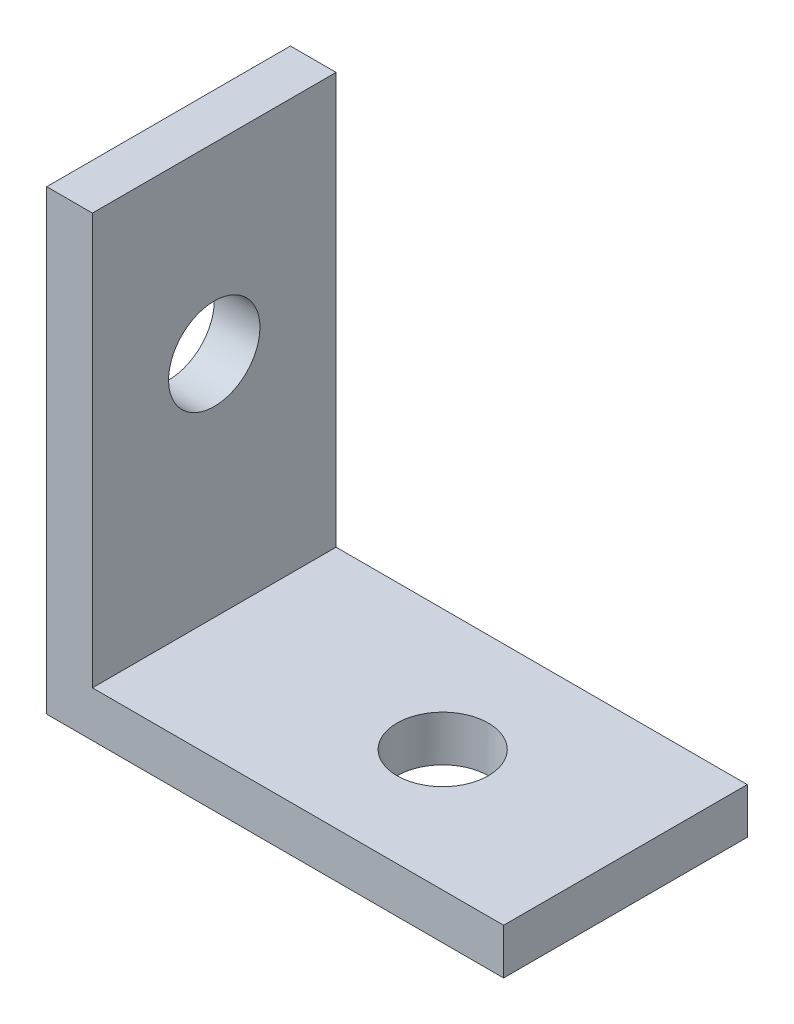
ISO-10303-21;
HEADER;
FILE_DESCRIPTION(('STEP AP214'),'2;1');
FILE_NAME('part.step','',(''),(''),'','','');
FILE_SCHEMA(('AUTOMOTIVE_DESIGN { 1 0 10303 214 1 1 1 1 }'));
ENDSEC;
DATA;
#1=APPLICATION_CONTEXT('core data for automotive mechanical design processes');
#2=APPLICATION_PROTOCOL_DEFINITION('international standard','automotive_design',2000,#1);
#3=PRODUCT_CONTEXT('',#1,'mechanical');
#4=PRODUCT('Part','Part','',(#3));
#5=PRODUCT_RELATED_PRODUCT_CATEGORY('part','',(#4));
#6=PRODUCT_DEFINITION_FORMATION('','',#4);
#7=PRODUCT_DEFINITION_CONTEXT('part definition',#1,'design');
#8=PRODUCT_DEFINITION('design','',#6,#7);
#9=PRODUCT_DEFINITION_SHAPE('','',#8);
#10=(LENGTH_UNIT() NAMED_UNIT(*) SI_UNIT(.MILLI.,.METRE.));
#11=(NAMED_UNIT(*) PLANE_ANGLE_UNIT() SI_UNIT($,.RADIAN.));
#12=(NAMED_UNIT(*) SI_UNIT($,.STERADIAN.) SOLID_ANGLE_UNIT());
#13=UNCERTAINTY_MEASURE_WITH_UNIT(LENGTH_MEASURE(1.E-05),#10,'distance_accuracy_value','');
#14=(GEOMETRIC_REPRESENTATION_CONTEXT(3) GLOBAL_UNCERTAINTY_ASSIGNED_CONTEXT((#13)) GLOBAL_UNIT_ASSIGNED_CONTEXT((#10,
#11,#12)) REPRESENTATION_CONTEXT('',''));
#15=CARTESIAN_POINT('',(0.,0.,0.));
#16=DIRECTION('',(0.,0.,1.));
#17=DIRECTION('',(1.,0.,0.));
#18=AXIS2_PLACEMENT_3D('',#15,#16,#17);
#19=CARTESIAN_POINT('',(-3.46371198178485,-21.095820103028,8.));
#20=DIRECTION('',(1.,0.,0.));
#21=DIRECTION('',(0.,0.,-1.));
#22=AXIS2_PLACEMENT_3D('',#19,#20,#21);
#23=PLANE('',#22);
#24=CARTESIAN_POINT('',(-3.46371198178486,-12.095820103028,4.));
#25=DIRECTION('',(1.,0.,0.));
#26=DIRECTION('',(0.,0.,-1.));
#27=AXIS2_PLACEMENT_3D('',#24,#25,#26);
#28=CIRCLE('',#27,1.5);
#29=CARTESIAN_POINT('',(-3.46371198178486,-12.095820103028,2.5));
#30=VERTEX_POINT('',#29);
#31=EDGE_CURVE('E118',#30,#30,#28,.T.);
#32=ORIENTED_EDGE('',*,*,#31,.T.);
#33=EDGE_LOOP('',(#32));
#34=FACE_BOUND('',#33,.T.);
#35=DIRECTION('',(0.,-1.,0.));
#36=VECTOR('',#35,1.);
#37=CARTESIAN_POINT('',(-3.46371198178485,-21.095820103028,0.));
#38=LINE('',#37,#36);
#39=CARTESIAN_POINT('',(-3.46371198178485,-6.09582010302802,0.));
#40=VERTEX_POINT('',#39);
#41=CARTESIAN_POINT('',(-3.46371198178485,-21.095820103028,0.));
#42=VERTEX_POINT('',#41);
#43=EDGE_CURVE('E114',#40,#42,#38,.T.);
#44=ORIENTED_EDGE('',*,*,#43,.T.);
#45=DIRECTION('',(0.,0.,-1.));
#46=VECTOR('',#45,1.);
#47=CARTESIAN_POINT('',(-3.46371198178485,-21.095820103028,8.));
#48=LINE('',#47,#46);
#49=CARTESIAN_POINT('',(-3.46371198178485,-21.095820103028,8.));
#50=VERTEX_POINT('',#49);
#51=EDGE_CURVE('E11',#50,#42,#48,.T.);
#52=ORIENTED_EDGE('',*,*,#51,.F.);
#53=DIRECTION('',(0.,-1.,0.));
#54=VECTOR('',#53,1.);
#55=CARTESIAN_POINT('',(-3.46371198178485,-21.095820103028,8.));
#56=LINE('',#55,#54);
#57=CARTESIAN_POINT('',(-3.46371198178485,-6.09582010302802,8.));
#58=VERTEX_POINT('',#57);
#59=EDGE_CURVE('E125',#58,#50,#56,.T.);
#60=ORIENTED_EDGE('',*,*,#59,.F.);
#61=DIRECTION('',(0.,0.,-1.));
#62=VECTOR('',#61,1.);
#63=CARTESIAN_POINT('',(-3.46371198178485,-6.09582010302802,8.));
#64=LINE('',#63,#62);
#65=EDGE_CURVE('E110',#58,#40,#64,.T.);
#66=ORIENTED_EDGE('',*,*,#65,.T.);
#67=EDGE_LOOP('',(#44,#52,#60,#66));
#68=FACE_BOUND('',#67,.T.);
#69=ADVANCED_FACE('F30',(#34,#68),#23,.F.);
#70=CARTESIAN_POINT('',(11.5362880182151,-21.095820103028,8.));
#71=DIRECTION('',(0.,1.,0.));
#72=DIRECTION('',(-1.,0.,0.));
#73=AXIS2_PLACEMENT_3D('',#70,#71,#72);
#74=PLANE('',#73);
#75=CARTESIAN_POINT('',(5.53628801821515,-21.095820103028,4.));
#76=DIRECTION('',(0.,1.,0.));
#77=DIRECTION('',(-1.,0.,0.));
#78=AXIS2_PLACEMENT_3D('',#75,#76,#77);
#79=CIRCLE('',#78,1.5);
#80=CARTESIAN_POINT('',(4.03628801821515,-21.095820103028,4.));
#81=VERTEX_POINT('',#80);
#82=EDGE_CURVE('E162',#81,#81,#79,.T.);
#83=ORIENTED_EDGE('',*,*,#82,.T.);
#84=EDGE_LOOP('',(#83));
#85=FACE_BOUND('',#84,.T.);
#86=DIRECTION('',(1.,0.,0.));
#87=VECTOR('',#86,1.);
#88=CARTESIAN_POINT('',(11.5362880182151,-21.095820103028,0.));
#89=LINE('',#88,#87);
#90=CARTESIAN_POINT('',(11.5362880182151,-21.095820103028,0.));
#91=VERTEX_POINT('',#90);
#92=EDGE_CURVE('E117',#42,#91,#89,.T.);
#93=ORIENTED_EDGE('',*,*,#92,.T.);
#94=DIRECTION('',(0.,0.,-1.));
#95=VECTOR('',#94,1.);
#96=CARTESIAN_POINT('',(11.5362880182151,-21.095820103028,8.));
#97=LINE('',#96,#95);
#98=CARTESIAN_POINT('',(11.5362880182151,-21.095820103028,8.));
#99=VERTEX_POINT('',#98);
#100=EDGE_CURVE('E38',#99,#91,#97,.T.);
#101=ORIENTED_EDGE('',*,*,#100,.F.);
#102=DIRECTION('',(1.,0.,0.));
#103=VECTOR('',#102,1.);
#104=CARTESIAN_POINT('',(11.5362880182151,-21.095820103028,8.));
#105=LINE('',#104,#103);
#106=EDGE_CURVE('E83',#50,#99,#105,.T.);
#107=ORIENTED_EDGE('',*,*,#106,.F.);
#108=ORIENTED_EDGE('',*,*,#51,.T.);
#109=EDGE_LOOP('',(#93,#101,#107,#108));
#110=FACE_BOUND('',#109,.T.);
#111=ADVANCED_FACE('F150',(#85,#110),#74,.F.);
#112=CARTESIAN_POINT('',(11.5362880182151,-19.595820103028,8.));
#113=DIRECTION('',(-1.,0.,0.));
#114=DIRECTION('',(0.,-1.,0.));
#115=AXIS2_PLACEMENT_3D('',#112,#113,#114);
#116=PLANE('',#115);
#117=DIRECTION('',(0.,1.,0.));
#118=VECTOR('',#117,1.);
#119=CARTESIAN_POINT('',(11.5362880182151,-19.595820103028,0.));
#120=LINE('',#119,#118);
#121=CARTESIAN_POINT('',(11.5362880182151,-19.595820103028,0.));
#122=VERTEX_POINT('',#121);
#123=EDGE_CURVE('E120',#91,#122,#120,.T.);
#124=ORIENTED_EDGE('',*,*,#123,.T.);
#125=DIRECTION('',(0.,0.,-1.));
#126=VECTOR('',#125,1.);
#127=CARTESIAN_POINT('',(11.5362880182151,-19.595820103028,8.));
#128=LINE('',#127,#126);
#129=CARTESIAN_POINT('',(11.5362880182151,-19.595820103028,8.));
#130=VERTEX_POINT('',#129);
#131=EDGE_CURVE('E105',#130,#122,#128,.T.);
#132=ORIENTED_EDGE('',*,*,#131,.F.);
#133=DIRECTION('',(0.,1.,0.));
#134=VECTOR('',#133,1.);
#135=CARTESIAN_POINT('',(11.5362880182151,-19.595820103028,8.));
#136=LINE('',#135,#134);
#137=EDGE_CURVE('E96',#99,#130,#136,.T.);
#138=ORIENTED_EDGE('',*,*,#137,.F.);
#139=ORIENTED_EDGE('',*,*,#100,.T.);
#140=EDGE_LOOP('',(#124,#132,#138,#139));
#141=FACE_BOUND('',#140,.T.);
#142=ADVANCED_FACE('F131',(#141),#116,.F.);
#143=CARTESIAN_POINT('',(-1.96371198178485,-19.595820103028,8.));
#144=DIRECTION('',(0.,-1.,0.));
#145=DIRECTION('',(0.,0.,-1.));
#146=AXIS2_PLACEMENT_3D('',#143,#144,#145);
#147=PLANE('',#146);
#148=CARTESIAN_POINT('',(5.53628801821515,-19.595820103028,4.));
#149=DIRECTION('',(0.,1.,0.));
#150=DIRECTION('',(0.,0.,1.));
#151=AXIS2_PLACEMENT_3D('',#148,#149,#150);
#152=CIRCLE('',#151,1.5);
#153=CARTESIAN_POINT('',(5.53628801821515,-19.595820103028,5.5));
#154=VERTEX_POINT('',#153);
#155=EDGE_CURVE('E169',#154,#154,#152,.T.);
#156=ORIENTED_EDGE('',*,*,#155,.F.);
#157=EDGE_LOOP('',(#156));
#158=FACE_BOUND('',#157,.T.);
#159=DIRECTION('',(-1.,0.,0.));
#160=VECTOR('',#159,1.);
#161=CARTESIAN_POINT('',(-1.96371198178485,-19.595820103028,0.));
#162=LINE('',#161,#160);
#163=CARTESIAN_POINT('',(-1.96371198178485,-19.595820103028,0.));
#164=VERTEX_POINT('',#163);
#165=EDGE_CURVE('E104',#122,#164,#162,.T.);
#166=ORIENTED_EDGE('',*,*,#165,.T.);
#167=DIRECTION('',(0.,0.,-1.));
#168=VECTOR('',#167,1.);
#169=CARTESIAN_POINT('',(-1.96371198178485,-19.595820103028,8.));
#170=LINE('',#169,#168);
#171=CARTESIAN_POINT('',(-1.96371198178485,-19.595820103028,8.));
#172=VERTEX_POINT('',#171);
#173=EDGE_CURVE('E101',#172,#164,#170,.T.);
#174=ORIENTED_EDGE('',*,*,#173,.F.);
#175=DIRECTION('',(-1.,0.,0.));
#176=VECTOR('',#175,1.);
#177=CARTESIAN_POINT('',(-1.96371198178485,-19.595820103028,8.));
#178=LINE('',#177,#176);
#179=EDGE_CURVE('E90',#130,#172,#178,.T.);
#180=ORIENTED_EDGE('',*,*,#179,.F.);
#181=ORIENTED_EDGE('',*,*,#131,.T.);
#182=EDGE_LOOP('',(#166,#174,#180,#181));
#183=FACE_BOUND('',#182,.T.);
#184=ADVANCED_FACE('F102',(#158,#183),#147,.F.);
#185=CARTESIAN_POINT('',(-1.96371198178485,-6.09582010302802,8.));
#186=DIRECTION('',(-1.,0.,0.));
#187=DIRECTION('',(0.,-1.,0.));
#188=AXIS2_PLACEMENT_3D('',#185,#186,#187);
#189=PLANE('',#188);
#190=CARTESIAN_POINT('',(-1.96371198178485,-12.095820103028,4.));
#191=DIRECTION('',(1.,0.,0.));
#192=DIRECTION('',(0.,1.,0.));
#193=AXIS2_PLACEMENT_3D('',#190,#191,#192);
#194=CIRCLE('',#193,1.5);
#195=CARTESIAN_POINT('',(-1.96371198178485,-10.595820103028,4.));
#196=VERTEX_POINT('',#195);
#197=EDGE_CURVE('E159',#196,#196,#194,.T.);
#198=ORIENTED_EDGE('',*,*,#197,.F.);
#199=EDGE_LOOP('',(#198));
#200=FACE_BOUND('',#199,.T.);
#201=DIRECTION('',(0.,1.,0.));
#202=VECTOR('',#201,1.);
#203=CARTESIAN_POINT('',(-1.96371198178485,-6.09582010302802,0.));
#204=LINE('',#203,#202);
#205=CARTESIAN_POINT('',(-1.96371198178485,-6.09582010302802,0.));
#206=VERTEX_POINT('',#205);
#207=EDGE_CURVE('E69',#164,#206,#204,.T.);
#208=ORIENTED_EDGE('',*,*,#207,.T.);
#209=DIRECTION('',(0.,0.,-1.));
#210=VECTOR('',#209,1.);
#211=CARTESIAN_POINT('',(-1.96371198178485,-6.09582010302802,8.));
#212=LINE('',#211,#210);
#213=CARTESIAN_POINT('',(-1.96371198178485,-6.09582010302802,8.));
#214=VERTEX_POINT('',#213);
#215=EDGE_CURVE('E106',#214,#206,#212,.T.);
#216=ORIENTED_EDGE('',*,*,#215,.F.);
#217=DIRECTION('',(0.,1.,0.));
#218=VECTOR('',#217,1.);
#219=CARTESIAN_POINT('',(-1.96371198178485,-6.09582010302802,8.));
#220=LINE('',#219,#218);
#221=EDGE_CURVE('E94',#172,#214,#220,.T.);
#222=ORIENTED_EDGE('',*,*,#221,.F.);
#223=ORIENTED_EDGE('',*,*,#173,.T.);
#224=EDGE_LOOP('',(#208,#216,#222,#223));
#225=FACE_BOUND('',#224,.T.);
#226=ADVANCED_FACE('F108',(#200,#225),#189,.F.);
#227=CARTESIAN_POINT('',(-3.46371198178485,-6.09582010302802,8.));
#228=DIRECTION('',(0.,-1.,0.));
#229=DIRECTION('',(0.,0.,-1.));
#230=AXIS2_PLACEMENT_3D('',#227,#228,#229);
#231=PLANE('',#230);
#232=DIRECTION('',(-1.,0.,0.));
#233=VECTOR('',#232,1.);
#234=CARTESIAN_POINT('',(-3.46371198178485,-6.09582010302802,0.));
#235=LINE('',#234,#233);
#236=EDGE_CURVE('E75',#206,#40,#235,.T.);
#237=ORIENTED_EDGE('',*,*,#236,.T.);
#238=ORIENTED_EDGE('',*,*,#65,.F.);
#239=DIRECTION('',(-1.,0.,0.));
#240=VECTOR('',#239,1.);
#241=CARTESIAN_POINT('',(-3.46371198178485,-6.09582010302802,8.));
#242=LINE('',#241,#240);
#243=EDGE_CURVE('E46',#214,#58,#242,.T.);
#244=ORIENTED_EDGE('',*,*,#243,.F.);
#245=ORIENTED_EDGE('',*,*,#215,.T.);
#246=EDGE_LOOP('',(#237,#238,#244,#245));
#247=FACE_BOUND('',#246,.T.);
#248=ADVANCED_FACE('F138',(#247),#231,.F.);
#249=CARTESIAN_POINT('',(-3.46371198178485,-6.09582010302802,8.));
#250=DIRECTION('',(0.,0.,-1.));
#251=DIRECTION('',(-1.,0.,0.));
#252=AXIS2_PLACEMENT_3D('',#249,#250,#251);
#253=PLANE('',#252);
#254=ORIENTED_EDGE('',*,*,#59,.T.);
#255=ORIENTED_EDGE('',*,*,#106,.T.);
#256=ORIENTED_EDGE('',*,*,#137,.T.);
#257=ORIENTED_EDGE('',*,*,#179,.T.);
#258=ORIENTED_EDGE('',*,*,#221,.T.);
#259=ORIENTED_EDGE('',*,*,#243,.T.);
#260=EDGE_LOOP('',(#254,#255,#256,#257,#258,#259));
#261=FACE_BOUND('',#260,.T.);
#262=ADVANCED_FACE('F92',(#261),#253,.F.);
#263=CARTESIAN_POINT('',(-3.46371198178485,-6.09582010302802,0.));
#264=DIRECTION('',(0.,0.,-1.));
#265=DIRECTION('',(-1.,0.,0.));
#266=AXIS2_PLACEMENT_3D('',#263,#264,#265);
#267=PLANE('',#266);
#268=ORIENTED_EDGE('',*,*,#43,.F.);
#269=ORIENTED_EDGE('',*,*,#236,.F.);
#270=ORIENTED_EDGE('',*,*,#207,.F.);
#271=ORIENTED_EDGE('',*,*,#165,.F.);
#272=ORIENTED_EDGE('',*,*,#123,.F.);
#273=ORIENTED_EDGE('',*,*,#92,.F.);
#274=EDGE_LOOP('',(#268,#269,#270,#271,#272,#273));
#275=FACE_BOUND('',#274,.T.);
#276=ADVANCED_FACE('F134',(#275),#267,.T.);
#277=CARTESIAN_POINT('',(-81.9637119817849,-12.095820103028,4.));
#278=DIRECTION('',(1.,0.,0.));
#279=DIRECTION('',(0.,1.,0.));
#280=AXIS2_PLACEMENT_3D('',#277,#278,#279);
#281=CYLINDRICAL_SURFACE('',#280,1.5);
#282=ORIENTED_EDGE('',*,*,#197,.T.);
#283=EDGE_LOOP('',(#282));
#284=FACE_BOUND('',#283,.T.);
#285=ORIENTED_EDGE('',*,*,#31,.F.);
#286=EDGE_LOOP('',(#285));
#287=FACE_BOUND('',#286,.T.);
#288=ADVANCED_FACE('F194',(#284,#287),#281,.F.);
#289=CARTESIAN_POINT('',(5.53628801821515,-99.595820103028,4.));
#290=DIRECTION('',(0.,1.,0.));
#291=DIRECTION('',(0.,0.,1.));
#292=AXIS2_PLACEMENT_3D('',#289,#290,#291);
#293=CYLINDRICAL_SURFACE('',#292,1.5);
#294=ORIENTED_EDGE('',*,*,#155,.T.);
#295=EDGE_LOOP('',(#294));
#296=FACE_BOUND('',#295,.T.);
#297=ORIENTED_EDGE('',*,*,#82,.F.);
#298=EDGE_LOOP('',(#297));
#299=FACE_BOUND('',#298,.T.);
#300=ADVANCED_FACE('F173',(#296,#299),#293,.F.);
#301=CLOSED_SHELL('',(#69,#111,#142,#184,#226,#248,#262,#276,#288,#300));
#302=MANIFOLD_SOLID_BREP('B2',#301);
#303=ADVANCED_BREP_SHAPE_REPRESENTATION('',(#18,#302),#14);
#304=SHAPE_DEFINITION_REPRESENTATION(#9,#303);
ENDSEC;
END-ISO-10303-21;
